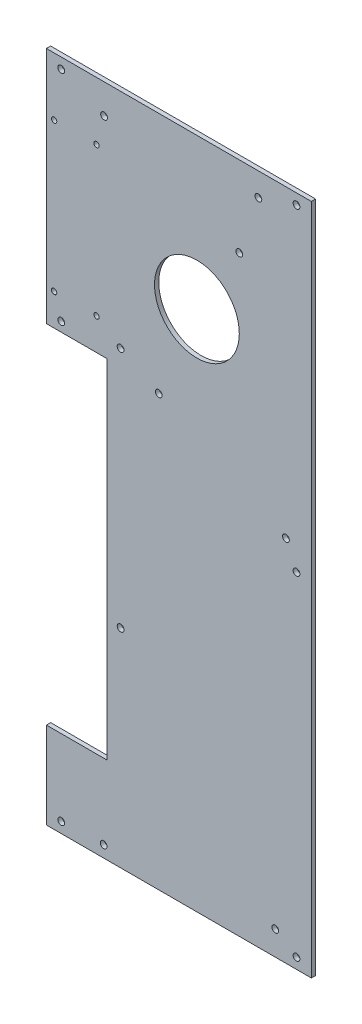
ISO-10303-21;
HEADER;
FILE_DESCRIPTION(('STEP AP214'),'2;1');
FILE_NAME('part.step','',(''),(''),'','','');
FILE_SCHEMA(('AUTOMOTIVE_DESIGN { 1 0 10303 214 1 1 1 1 }'));
ENDSEC;
DATA;
#1=APPLICATION_CONTEXT('core data for automotive mechanical design processes');
#2=APPLICATION_PROTOCOL_DEFINITION('international standard','automotive_design',2000,#1);
#3=PRODUCT_CONTEXT('',#1,'mechanical');
#4=PRODUCT('Part','Part','',(#3));
#5=PRODUCT_RELATED_PRODUCT_CATEGORY('part','',(#4));
#6=PRODUCT_DEFINITION_FORMATION('','',#4);
#7=PRODUCT_DEFINITION_CONTEXT('part definition',#1,'design');
#8=PRODUCT_DEFINITION('design','',#6,#7);
#9=PRODUCT_DEFINITION_SHAPE('','',#8);
#10=(LENGTH_UNIT() NAMED_UNIT(*) SI_UNIT(.MILLI.,.METRE.));
#11=(NAMED_UNIT(*) PLANE_ANGLE_UNIT() SI_UNIT($,.RADIAN.));
#12=(NAMED_UNIT(*) SI_UNIT($,.STERADIAN.) SOLID_ANGLE_UNIT());
#13=UNCERTAINTY_MEASURE_WITH_UNIT(LENGTH_MEASURE(1.E-05),#10,'distance_accuracy_value','');
#14=(GEOMETRIC_REPRESENTATION_CONTEXT(3) GLOBAL_UNCERTAINTY_ASSIGNED_CONTEXT((#13)) GLOBAL_UNIT_ASSIGNED_CONTEXT((#10,
#11,#12)) REPRESENTATION_CONTEXT('',''));
#15=CARTESIAN_POINT('',(0.,0.,0.));
#16=DIRECTION('',(0.,0.,1.));
#17=DIRECTION('',(1.,0.,0.));
#18=AXIS2_PLACEMENT_3D('',#15,#16,#17);
#19=CARTESIAN_POINT('',(-35.0000000000001,0.,-2.));
#20=DIRECTION('',(1.,0.,0.));
#21=DIRECTION('',(0.,1.,0.));
#22=AXIS2_PLACEMENT_3D('',#19,#20,#21);
#23=PLANE('',#22);
#24=DIRECTION('',(0.,1.,0.));
#25=VECTOR('',#24,1.);
#26=CARTESIAN_POINT('',(-35.0000000000001,0.,0.));
#27=LINE('',#26,#25);
#28=CARTESIAN_POINT('',(-35.,106.85,0.));
#29=VERTEX_POINT('',#28);
#30=CARTESIAN_POINT('',(-35.,219.3,0.));
#31=VERTEX_POINT('',#30);
#32=EDGE_CURVE('E201',#29,#31,#27,.T.);
#33=ORIENTED_EDGE('',*,*,#32,.T.);
#34=DIRECTION('',(0.,0.,1.));
#35=VECTOR('',#34,1.);
#36=CARTESIAN_POINT('',(-35.,219.3,-2.));
#37=LINE('',#36,#35);
#38=CARTESIAN_POINT('',(-35.,219.3,-2.));
#39=VERTEX_POINT('',#38);
#40=EDGE_CURVE('E11',#39,#31,#37,.T.);
#41=ORIENTED_EDGE('',*,*,#40,.F.);
#42=DIRECTION('',(0.,1.,0.));
#43=VECTOR('',#42,1.);
#44=CARTESIAN_POINT('',(-35.0000000000001,0.,-2.));
#45=LINE('',#44,#43);
#46=CARTESIAN_POINT('',(-35.,106.85,-2.));
#47=VERTEX_POINT('',#46);
#48=EDGE_CURVE('E278',#47,#39,#45,.T.);
#49=ORIENTED_EDGE('',*,*,#48,.F.);
#50=DIRECTION('',(0.,0.,1.));
#51=VECTOR('',#50,1.);
#52=CARTESIAN_POINT('',(-35.,106.85,-2.));
#53=LINE('',#52,#51);
#54=EDGE_CURVE('E46',#47,#29,#53,.T.);
#55=ORIENTED_EDGE('',*,*,#54,.T.);
#56=EDGE_LOOP('',(#33,#41,#49,#55));
#57=FACE_BOUND('',#56,.T.);
#58=ADVANCED_FACE('F43',(#57),#23,.F.);
#59=CARTESIAN_POINT('',(0.,219.3,-2.));
#60=DIRECTION('',(0.,-1.,0.));
#61=DIRECTION('',(0.,0.,-1.));
#62=AXIS2_PLACEMENT_3D('',#59,#60,#61);
#63=PLANE('',#62);
#64=DIRECTION('',(1.,0.,0.));
#65=VECTOR('',#64,1.);
#66=CARTESIAN_POINT('',(0.,219.3,0.));
#67=LINE('',#66,#65);
#68=CARTESIAN_POINT('',(90.,219.3,0.));
#69=VERTEX_POINT('',#68);
#70=EDGE_CURVE('E92',#31,#69,#67,.T.);
#71=ORIENTED_EDGE('',*,*,#70,.T.);
#72=DIRECTION('',(0.,0.,1.));
#73=VECTOR('',#72,1.);
#74=CARTESIAN_POINT('',(90.,219.3,-2.));
#75=LINE('',#74,#73);
#76=CARTESIAN_POINT('',(90.,219.3,-2.));
#77=VERTEX_POINT('',#76);
#78=EDGE_CURVE('E55',#77,#69,#75,.T.);
#79=ORIENTED_EDGE('',*,*,#78,.F.);
#80=DIRECTION('',(1.,0.,0.));
#81=VECTOR('',#80,1.);
#82=CARTESIAN_POINT('',(0.,219.3,-2.));
#83=LINE('',#82,#81);
#84=EDGE_CURVE('E58',#39,#77,#83,.T.);
#85=ORIENTED_EDGE('',*,*,#84,.F.);
#86=ORIENTED_EDGE('',*,*,#40,.T.);
#87=EDGE_LOOP('',(#71,#79,#85,#86));
#88=FACE_BOUND('',#87,.T.);
#89=ADVANCED_FACE('F307',(#88),#63,.F.);
#90=CARTESIAN_POINT('',(90.,0.,-2.));
#91=DIRECTION('',(1.,0.,0.));
#92=DIRECTION('',(0.,0.,-1.));
#93=AXIS2_PLACEMENT_3D('',#90,#91,#92);
#94=PLANE('',#93);
#95=DIRECTION('',(0.,1.,0.));
#96=VECTOR('',#95,1.);
#97=CARTESIAN_POINT('',(90.,0.,0.));
#98=LINE('',#97,#96);
#99=CARTESIAN_POINT('',(90.,-98.,0.));
#100=VERTEX_POINT('',#99);
#101=EDGE_CURVE('E117',#100,#69,#98,.T.);
#102=ORIENTED_EDGE('',*,*,#101,.F.);
#103=DIRECTION('',(0.,0.,1.));
#104=VECTOR('',#103,1.);
#105=CARTESIAN_POINT('',(90.,-98.,-2.));
#106=LINE('',#105,#104);
#107=CARTESIAN_POINT('',(90.,-98.,-2.));
#108=VERTEX_POINT('',#107);
#109=EDGE_CURVE('E112',#108,#100,#106,.T.);
#110=ORIENTED_EDGE('',*,*,#109,.F.);
#111=DIRECTION('',(0.,1.,0.));
#112=VECTOR('',#111,1.);
#113=CARTESIAN_POINT('',(90.,0.,-2.));
#114=LINE('',#113,#112);
#115=EDGE_CURVE('E120',#108,#77,#114,.T.);
#116=ORIENTED_EDGE('',*,*,#115,.T.);
#117=ORIENTED_EDGE('',*,*,#78,.T.);
#118=EDGE_LOOP('',(#102,#110,#116,#117));
#119=FACE_BOUND('',#118,.T.);
#120=ADVANCED_FACE('F116',(#119),#94,.T.);
#121=CARTESIAN_POINT('',(0.,-98.,-2.));
#122=DIRECTION('',(0.,-1.,0.));
#123=DIRECTION('',(1.,0.,0.));
#124=AXIS2_PLACEMENT_3D('',#121,#122,#123);
#125=PLANE('',#124);
#126=DIRECTION('',(1.,0.,0.));
#127=VECTOR('',#126,1.);
#128=CARTESIAN_POINT('',(0.,-98.,0.));
#129=LINE('',#128,#127);
#130=CARTESIAN_POINT('',(-35.,-98.,0.));
#131=VERTEX_POINT('',#130);
#132=EDGE_CURVE('E217',#131,#100,#129,.T.);
#133=ORIENTED_EDGE('',*,*,#132,.F.);
#134=DIRECTION('',(0.,0.,1.));
#135=VECTOR('',#134,1.);
#136=CARTESIAN_POINT('',(-35.,-98.,-2.));
#137=LINE('',#136,#135);
#138=CARTESIAN_POINT('',(-35.,-98.,-2.));
#139=VERTEX_POINT('',#138);
#140=EDGE_CURVE('E124',#139,#131,#137,.T.);
#141=ORIENTED_EDGE('',*,*,#140,.F.);
#142=DIRECTION('',(1.,0.,0.));
#143=VECTOR('',#142,1.);
#144=CARTESIAN_POINT('',(0.,-98.,-2.));
#145=LINE('',#144,#143);
#146=EDGE_CURVE('E127',#139,#108,#145,.T.);
#147=ORIENTED_EDGE('',*,*,#146,.T.);
#148=ORIENTED_EDGE('',*,*,#109,.T.);
#149=EDGE_LOOP('',(#133,#141,#147,#148));
#150=FACE_BOUND('',#149,.T.);
#151=ADVANCED_FACE('F133',(#150),#125,.T.);
#152=CARTESIAN_POINT('',(-35.0000000000001,0.,-2.));
#153=DIRECTION('',(-1.,0.,0.));
#154=DIRECTION('',(0.,-1.,0.));
#155=AXIS2_PLACEMENT_3D('',#152,#153,#154);
#156=PLANE('',#155);
#157=DIRECTION('',(0.,-1.,0.));
#158=VECTOR('',#157,1.);
#159=CARTESIAN_POINT('',(-35.0000000000001,0.,0.));
#160=LINE('',#159,#158);
#161=CARTESIAN_POINT('',(-35.,-57.15,0.));
#162=VERTEX_POINT('',#161);
#163=EDGE_CURVE('E215',#162,#131,#160,.T.);
#164=ORIENTED_EDGE('',*,*,#163,.F.);
#165=DIRECTION('',(0.,0.,1.));
#166=VECTOR('',#165,1.);
#167=CARTESIAN_POINT('',(-35.,-57.15,-2.));
#168=LINE('',#167,#166);
#169=CARTESIAN_POINT('',(-35.,-57.15,-2.));
#170=VERTEX_POINT('',#169);
#171=EDGE_CURVE('E283',#170,#162,#168,.T.);
#172=ORIENTED_EDGE('',*,*,#171,.F.);
#173=DIRECTION('',(0.,-1.,0.));
#174=VECTOR('',#173,1.);
#175=CARTESIAN_POINT('',(-35.0000000000001,0.,-2.));
#176=LINE('',#175,#174);
#177=EDGE_CURVE('E134',#170,#139,#176,.T.);
#178=ORIENTED_EDGE('',*,*,#177,.T.);
#179=ORIENTED_EDGE('',*,*,#140,.T.);
#180=EDGE_LOOP('',(#164,#172,#178,#179));
#181=FACE_BOUND('',#180,.T.);
#182=ADVANCED_FACE('F321',(#181),#156,.T.);
#183=CARTESIAN_POINT('',(0.,-57.15,-2.));
#184=DIRECTION('',(0.,1.,0.));
#185=DIRECTION('',(-1.,0.,0.));
#186=AXIS2_PLACEMENT_3D('',#183,#184,#185);
#187=PLANE('',#186);
#188=DIRECTION('',(-1.,0.,0.));
#189=VECTOR('',#188,1.);
#190=CARTESIAN_POINT('',(0.,-57.15,0.));
#191=LINE('',#190,#189);
#192=CARTESIAN_POINT('',(-6.35,-57.15,0.));
#193=VERTEX_POINT('',#192);
#194=EDGE_CURVE('E208',#193,#162,#191,.T.);
#195=ORIENTED_EDGE('',*,*,#194,.F.);
#196=DIRECTION('',(0.,0.,1.));
#197=VECTOR('',#196,1.);
#198=CARTESIAN_POINT('',(-6.35,-57.15,-2.));
#199=LINE('',#198,#197);
#200=CARTESIAN_POINT('',(-6.35,-57.15,-2.));
#201=VERTEX_POINT('',#200);
#202=EDGE_CURVE('E281',#201,#193,#199,.T.);
#203=ORIENTED_EDGE('',*,*,#202,.F.);
#204=DIRECTION('',(-1.,0.,0.));
#205=VECTOR('',#204,1.);
#206=CARTESIAN_POINT('',(0.,-57.15,-2.));
#207=LINE('',#206,#205);
#208=EDGE_CURVE('E136',#201,#170,#207,.T.);
#209=ORIENTED_EDGE('',*,*,#208,.T.);
#210=ORIENTED_EDGE('',*,*,#171,.T.);
#211=EDGE_LOOP('',(#195,#203,#209,#210));
#212=FACE_BOUND('',#211,.T.);
#213=ADVANCED_FACE('F322',(#212),#187,.T.);
#214=CARTESIAN_POINT('',(-6.35,0.,-2.));
#215=DIRECTION('',(1.,0.,0.));
#216=DIRECTION('',(0.,1.,0.));
#217=AXIS2_PLACEMENT_3D('',#214,#215,#216);
#218=PLANE('',#217);
#219=DIRECTION('',(0.,1.,0.));
#220=VECTOR('',#219,1.);
#221=CARTESIAN_POINT('',(-6.35,0.,0.));
#222=LINE('',#221,#220);
#223=CARTESIAN_POINT('',(-6.35,106.85,0.));
#224=VERTEX_POINT('',#223);
#225=EDGE_CURVE('E210',#193,#224,#222,.T.);
#226=ORIENTED_EDGE('',*,*,#225,.T.);
#227=DIRECTION('',(0.,0.,1.));
#228=VECTOR('',#227,1.);
#229=CARTESIAN_POINT('',(-6.35,106.85,-2.));
#230=LINE('',#229,#228);
#231=CARTESIAN_POINT('',(-6.35,106.85,-2.));
#232=VERTEX_POINT('',#231);
#233=EDGE_CURVE('E286',#232,#224,#230,.T.);
#234=ORIENTED_EDGE('',*,*,#233,.F.);
#235=DIRECTION('',(0.,1.,0.));
#236=VECTOR('',#235,1.);
#237=CARTESIAN_POINT('',(-6.35,0.,-2.));
#238=LINE('',#237,#236);
#239=EDGE_CURVE('E343',#201,#232,#238,.T.);
#240=ORIENTED_EDGE('',*,*,#239,.F.);
#241=ORIENTED_EDGE('',*,*,#202,.T.);
#242=EDGE_LOOP('',(#226,#234,#240,#241));
#243=FACE_BOUND('',#242,.T.);
#244=ADVANCED_FACE('F328',(#243),#218,.F.);
#245=CARTESIAN_POINT('',(-28.,-93.,-2.));
#246=DIRECTION('',(0.,0.,1.));
#247=DIRECTION('',(1.,0.,0.));
#248=AXIS2_PLACEMENT_3D('',#245,#246,#247);
#249=CYLINDRICAL_SURFACE('',#248,1.6);
#250=CARTESIAN_POINT('',(-28.,-93.,-2.));
#251=DIRECTION('',(0.,0.,1.));
#252=DIRECTION('',(1.,0.,0.));
#253=AXIS2_PLACEMENT_3D('',#250,#251,#252);
#254=CIRCLE('',#253,1.6);
#255=CARTESIAN_POINT('',(-26.4,-93.,-2.));
#256=VERTEX_POINT('',#255);
#257=EDGE_CURVE('E192',#256,#256,#254,.T.);
#258=ORIENTED_EDGE('',*,*,#257,.F.);
#259=EDGE_LOOP('',(#258));
#260=FACE_BOUND('',#259,.T.);
#261=CARTESIAN_POINT('',(-28.,-93.,0.));
#262=DIRECTION('',(0.,0.,1.));
#263=DIRECTION('',(1.,0.,0.));
#264=AXIS2_PLACEMENT_3D('',#261,#262,#263);
#265=CIRCLE('',#264,1.6);
#266=CARTESIAN_POINT('',(-26.4,-93.,0.));
#267=VERTEX_POINT('',#266);
#268=EDGE_CURVE('E274',#267,#267,#265,.T.);
#269=ORIENTED_EDGE('',*,*,#268,.T.);
#270=EDGE_LOOP('',(#269));
#271=FACE_BOUND('',#270,.T.);
#272=ADVANCED_FACE('F331',(#260,#271),#249,.F.);
#273=CARTESIAN_POINT('',(-31.35,121.85,-2.));
#274=DIRECTION('',(0.,0.,1.));
#275=DIRECTION('',(1.,0.,0.));
#276=AXIS2_PLACEMENT_3D('',#273,#274,#275);
#277=CYLINDRICAL_SURFACE('',#276,1.25);
#278=CARTESIAN_POINT('',(-31.35,121.85,-2.));
#279=DIRECTION('',(0.,0.,1.));
#280=DIRECTION('',(1.,0.,0.));
#281=AXIS2_PLACEMENT_3D('',#278,#279,#280);
#282=CIRCLE('',#281,1.25);
#283=CARTESIAN_POINT('',(-30.1,121.85,-2.));
#284=VERTEX_POINT('',#283);
#285=EDGE_CURVE('E191',#284,#284,#282,.T.);
#286=ORIENTED_EDGE('',*,*,#285,.F.);
#287=EDGE_LOOP('',(#286));
#288=FACE_BOUND('',#287,.T.);
#289=CARTESIAN_POINT('',(-31.35,121.85,0.));
#290=DIRECTION('',(0.,0.,1.));
#291=DIRECTION('',(1.,0.,0.));
#292=AXIS2_PLACEMENT_3D('',#289,#290,#291);
#293=CIRCLE('',#292,1.25);
#294=CARTESIAN_POINT('',(-30.1,121.85,0.));
#295=VERTEX_POINT('',#294);
#296=EDGE_CURVE('E272',#295,#295,#293,.T.);
#297=ORIENTED_EDGE('',*,*,#296,.T.);
#298=EDGE_LOOP('',(#297));
#299=FACE_BOUND('',#298,.T.);
#300=ADVANCED_FACE('F337',(#288,#299),#277,.F.);
#301=CARTESIAN_POINT('',(-11.35,121.85,-2.));
#302=DIRECTION('',(0.,0.,1.));
#303=DIRECTION('',(1.,0.,0.));
#304=AXIS2_PLACEMENT_3D('',#301,#302,#303);
#305=CYLINDRICAL_SURFACE('',#304,1.25);
#306=CARTESIAN_POINT('',(-11.35,121.85,-2.));
#307=DIRECTION('',(0.,0.,1.));
#308=DIRECTION('',(1.,0.,0.));
#309=AXIS2_PLACEMENT_3D('',#306,#307,#308);
#310=CIRCLE('',#309,1.25);
#311=CARTESIAN_POINT('',(-10.1,121.85,-2.));
#312=VERTEX_POINT('',#311);
#313=EDGE_CURVE('E186',#312,#312,#310,.T.);
#314=ORIENTED_EDGE('',*,*,#313,.F.);
#315=EDGE_LOOP('',(#314));
#316=FACE_BOUND('',#315,.T.);
#317=CARTESIAN_POINT('',(-11.35,121.85,0.));
#318=DIRECTION('',(0.,0.,1.));
#319=DIRECTION('',(1.,0.,0.));
#320=AXIS2_PLACEMENT_3D('',#317,#318,#319);
#321=CIRCLE('',#320,1.25);
#322=CARTESIAN_POINT('',(-10.1,121.85,0.));
#323=VERTEX_POINT('',#322);
#324=EDGE_CURVE('E268',#323,#323,#321,.T.);
#325=ORIENTED_EDGE('',*,*,#324,.T.);
#326=EDGE_LOOP('',(#325));
#327=FACE_BOUND('',#326,.T.);
#328=ADVANCED_FACE('F355',(#316,#327),#305,.F.);
#329=CARTESIAN_POINT('',(-11.35,191.85,-2.));
#330=DIRECTION('',(0.,0.,1.));
#331=DIRECTION('',(1.,0.,0.));
#332=AXIS2_PLACEMENT_3D('',#329,#330,#331);
#333=CYLINDRICAL_SURFACE('',#332,1.25000000000001);
#334=CARTESIAN_POINT('',(-11.35,191.85,-2.));
#335=DIRECTION('',(0.,0.,1.));
#336=DIRECTION('',(1.,0.,0.));
#337=AXIS2_PLACEMENT_3D('',#334,#335,#336);
#338=CIRCLE('',#337,1.25000000000001);
#339=CARTESIAN_POINT('',(-10.1,191.85,-2.));
#340=VERTEX_POINT('',#339);
#341=EDGE_CURVE('E187',#340,#340,#338,.T.);
#342=ORIENTED_EDGE('',*,*,#341,.F.);
#343=EDGE_LOOP('',(#342));
#344=FACE_BOUND('',#343,.T.);
#345=CARTESIAN_POINT('',(-11.35,191.85,0.));
#346=DIRECTION('',(0.,0.,1.));
#347=DIRECTION('',(1.,0.,0.));
#348=AXIS2_PLACEMENT_3D('',#345,#346,#347);
#349=CIRCLE('',#348,1.25000000000001);
#350=CARTESIAN_POINT('',(-10.1,191.85,0.));
#351=VERTEX_POINT('',#350);
#352=EDGE_CURVE('E261',#351,#351,#349,.T.);
#353=ORIENTED_EDGE('',*,*,#352,.T.);
#354=EDGE_LOOP('',(#353));
#355=FACE_BOUND('',#354,.T.);
#356=ADVANCED_FACE('F363',(#344,#355),#333,.F.);
#357=CARTESIAN_POINT('',(-31.35,191.85,-2.));
#358=DIRECTION('',(0.,0.,1.));
#359=DIRECTION('',(1.,0.,0.));
#360=AXIS2_PLACEMENT_3D('',#357,#358,#359);
#361=CYLINDRICAL_SURFACE('',#360,1.24999999999998);
#362=CARTESIAN_POINT('',(-31.35,191.85,-2.));
#363=DIRECTION('',(0.,0.,1.));
#364=DIRECTION('',(1.,0.,0.));
#365=AXIS2_PLACEMENT_3D('',#362,#363,#364);
#366=CIRCLE('',#365,1.24999999999998);
#367=CARTESIAN_POINT('',(-30.1,191.85,-2.));
#368=VERTEX_POINT('',#367);
#369=EDGE_CURVE('E182',#368,#368,#366,.T.);
#370=ORIENTED_EDGE('',*,*,#369,.F.);
#371=EDGE_LOOP('',(#370));
#372=FACE_BOUND('',#371,.T.);
#373=CARTESIAN_POINT('',(-31.35,191.85,0.));
#374=DIRECTION('',(0.,0.,1.));
#375=DIRECTION('',(1.,0.,0.));
#376=AXIS2_PLACEMENT_3D('',#373,#374,#375);
#377=CIRCLE('',#376,1.24999999999998);
#378=CARTESIAN_POINT('',(-30.1,191.85,0.));
#379=VERTEX_POINT('',#378);
#380=EDGE_CURVE('E265',#379,#379,#377,.T.);
#381=ORIENTED_EDGE('',*,*,#380,.T.);
#382=EDGE_LOOP('',(#381));
#383=FACE_BOUND('',#382,.T.);
#384=ADVANCED_FACE('F362',(#372,#383),#361,.F.);
#385=CARTESIAN_POINT('',(-28.,111.3,-2.));
#386=DIRECTION('',(0.,0.,1.));
#387=DIRECTION('',(1.,0.,0.));
#388=AXIS2_PLACEMENT_3D('',#385,#386,#387);
#389=CYLINDRICAL_SURFACE('',#388,1.6);
#390=CARTESIAN_POINT('',(-28.,111.3,-2.));
#391=DIRECTION('',(0.,0.,1.));
#392=DIRECTION('',(1.,0.,0.));
#393=AXIS2_PLACEMENT_3D('',#390,#391,#392);
#394=CIRCLE('',#393,1.6);
#395=CARTESIAN_POINT('',(-26.4,111.3,-2.));
#396=VERTEX_POINT('',#395);
#397=EDGE_CURVE('E179',#396,#396,#394,.T.);
#398=ORIENTED_EDGE('',*,*,#397,.F.);
#399=EDGE_LOOP('',(#398));
#400=FACE_BOUND('',#399,.T.);
#401=CARTESIAN_POINT('',(-28.,111.3,0.));
#402=DIRECTION('',(0.,0.,1.));
#403=DIRECTION('',(1.,0.,0.));
#404=AXIS2_PLACEMENT_3D('',#401,#402,#403);
#405=CIRCLE('',#404,1.6);
#406=CARTESIAN_POINT('',(-26.4,111.3,0.));
#407=VERTEX_POINT('',#406);
#408=EDGE_CURVE('E258',#407,#407,#405,.T.);
#409=ORIENTED_EDGE('',*,*,#408,.T.);
#410=EDGE_LOOP('',(#409));
#411=FACE_BOUND('',#410,.T.);
#412=ADVANCED_FACE('F367',(#400,#411),#389,.F.);
#413=CARTESIAN_POINT('',(-28.,214.3,-2.));
#414=DIRECTION('',(0.,0.,1.));
#415=DIRECTION('',(1.,0.,0.));
#416=AXIS2_PLACEMENT_3D('',#413,#414,#415);
#417=CYLINDRICAL_SURFACE('',#416,1.59999999999999);
#418=CARTESIAN_POINT('',(-28.,214.3,-2.));
#419=DIRECTION('',(0.,0.,1.));
#420=DIRECTION('',(1.,0.,0.));
#421=AXIS2_PLACEMENT_3D('',#418,#419,#420);
#422=CIRCLE('',#421,1.59999999999999);
#423=CARTESIAN_POINT('',(-26.4,214.3,-2.));
#424=VERTEX_POINT('',#423);
#425=EDGE_CURVE('E180',#424,#424,#422,.T.);
#426=ORIENTED_EDGE('',*,*,#425,.F.);
#427=EDGE_LOOP('',(#426));
#428=FACE_BOUND('',#427,.T.);
#429=CARTESIAN_POINT('',(-28.,214.3,0.));
#430=DIRECTION('',(0.,0.,1.));
#431=DIRECTION('',(1.,0.,0.));
#432=AXIS2_PLACEMENT_3D('',#429,#430,#431);
#433=CIRCLE('',#432,1.59999999999999);
#434=CARTESIAN_POINT('',(-26.4,214.3,0.));
#435=VERTEX_POINT('',#434);
#436=EDGE_CURVE('E259',#435,#435,#433,.T.);
#437=ORIENTED_EDGE('',*,*,#436,.T.);
#438=EDGE_LOOP('',(#437));
#439=FACE_BOUND('',#438,.T.);
#440=ADVANCED_FACE('F373',(#428,#439),#417,.F.);
#441=CARTESIAN_POINT('',(73.,-86.5,-2.));
#442=DIRECTION('',(0.,0.,1.));
#443=DIRECTION('',(1.,0.,0.));
#444=AXIS2_PLACEMENT_3D('',#441,#442,#443);
#445=CYLINDRICAL_SURFACE('',#444,1.60000000000001);
#446=CARTESIAN_POINT('',(73.,-86.5,-2.));
#447=DIRECTION('',(0.,0.,1.));
#448=DIRECTION('',(1.,0.,0.));
#449=AXIS2_PLACEMENT_3D('',#446,#447,#448);
#450=CIRCLE('',#449,1.60000000000001);
#451=CARTESIAN_POINT('',(74.6,-86.5,-2.));
#452=VERTEX_POINT('',#451);
#453=EDGE_CURVE('E172',#452,#452,#450,.T.);
#454=ORIENTED_EDGE('',*,*,#453,.F.);
#455=EDGE_LOOP('',(#454));
#456=FACE_BOUND('',#455,.T.);
#457=CARTESIAN_POINT('',(73.,-86.5,0.));
#458=DIRECTION('',(0.,0.,1.));
#459=DIRECTION('',(1.,0.,0.));
#460=AXIS2_PLACEMENT_3D('',#457,#458,#459);
#461=CIRCLE('',#460,1.60000000000001);
#462=CARTESIAN_POINT('',(74.6,-86.5,0.));
#463=VERTEX_POINT('',#462);
#464=EDGE_CURVE('E254',#463,#463,#461,.T.);
#465=ORIENTED_EDGE('',*,*,#464,.T.);
#466=EDGE_LOOP('',(#465));
#467=FACE_BOUND('',#466,.T.);
#468=ADVANCED_FACE('F380',(#456,#467),#445,.F.);
#469=CARTESIAN_POINT('',(0.,0.,-2.));
#470=DIRECTION('',(0.,0.,1.));
#471=DIRECTION('',(1.,0.,0.));
#472=AXIS2_PLACEMENT_3D('',#469,#470,#471);
#473=CYLINDRICAL_SURFACE('',#472,1.6);
#474=CARTESIAN_POINT('',(0.,0.,-2.));
#475=DIRECTION('',(0.,0.,1.));
#476=DIRECTION('',(1.,0.,0.));
#477=AXIS2_PLACEMENT_3D('',#474,#475,#476);
#478=CIRCLE('',#477,1.6);
#479=CARTESIAN_POINT('',(1.6,0.,-2.));
#480=VERTEX_POINT('',#479);
#481=EDGE_CURVE('E171',#480,#480,#478,.T.);
#482=ORIENTED_EDGE('',*,*,#481,.F.);
#483=EDGE_LOOP('',(#482));
#484=FACE_BOUND('',#483,.T.);
#485=CARTESIAN_POINT('',(0.,0.,0.));
#486=DIRECTION('',(0.,0.,1.));
#487=DIRECTION('',(1.,0.,0.));
#488=AXIS2_PLACEMENT_3D('',#485,#486,#487);
#489=CIRCLE('',#488,1.6);
#490=CARTESIAN_POINT('',(1.6,0.,0.));
#491=VERTEX_POINT('',#490);
#492=EDGE_CURVE('E249',#491,#491,#489,.T.);
#493=ORIENTED_EDGE('',*,*,#492,.T.);
#494=EDGE_LOOP('',(#493));
#495=FACE_BOUND('',#494,.T.);
#496=ADVANCED_FACE('F382',(#484,#495),#473,.F.);
#497=CARTESIAN_POINT('',(0.,114.3,-2.));
#498=DIRECTION('',(0.,0.,1.));
#499=DIRECTION('',(1.,0.,0.));
#500=AXIS2_PLACEMENT_3D('',#497,#498,#499);
#501=CYLINDRICAL_SURFACE('',#500,1.60000000000001);
#502=CARTESIAN_POINT('',(0.,114.3,-2.));
#503=DIRECTION('',(0.,0.,1.));
#504=DIRECTION('',(1.,0.,0.));
#505=AXIS2_PLACEMENT_3D('',#502,#503,#504);
#506=CIRCLE('',#505,1.60000000000001);
#507=CARTESIAN_POINT('',(1.60000000000001,114.3,-2.));
#508=VERTEX_POINT('',#507);
#509=EDGE_CURVE('E166',#508,#508,#506,.T.);
#510=ORIENTED_EDGE('',*,*,#509,.F.);
#511=EDGE_LOOP('',(#510));
#512=FACE_BOUND('',#511,.T.);
#513=CARTESIAN_POINT('',(0.,114.3,0.));
#514=DIRECTION('',(0.,0.,1.));
#515=DIRECTION('',(1.,0.,0.));
#516=AXIS2_PLACEMENT_3D('',#513,#514,#515);
#517=CIRCLE('',#516,1.60000000000001);
#518=CARTESIAN_POINT('',(1.60000000000001,114.3,0.));
#519=VERTEX_POINT('',#518);
#520=EDGE_CURVE('E250',#519,#519,#517,.T.);
#521=ORIENTED_EDGE('',*,*,#520,.T.);
#522=EDGE_LOOP('',(#521));
#523=FACE_BOUND('',#522,.T.);
#524=ADVANCED_FACE('F383',(#512,#523),#501,.F.);
#525=CARTESIAN_POINT('',(18.,104.8,-2.));
#526=DIRECTION('',(0.,0.,1.));
#527=DIRECTION('',(1.,0.,0.));
#528=AXIS2_PLACEMENT_3D('',#525,#526,#527);
#529=CYLINDRICAL_SURFACE('',#528,1.6);
#530=CARTESIAN_POINT('',(18.,104.8,-2.));
#531=DIRECTION('',(0.,0.,1.));
#532=DIRECTION('',(1.,0.,0.));
#533=AXIS2_PLACEMENT_3D('',#530,#531,#532);
#534=CIRCLE('',#533,1.6);
#535=CARTESIAN_POINT('',(19.6,104.8,-2.));
#536=VERTEX_POINT('',#535);
#537=EDGE_CURVE('E164',#536,#536,#534,.T.);
#538=ORIENTED_EDGE('',*,*,#537,.F.);
#539=EDGE_LOOP('',(#538));
#540=FACE_BOUND('',#539,.T.);
#541=CARTESIAN_POINT('',(18.,104.8,0.));
#542=DIRECTION('',(0.,0.,1.));
#543=DIRECTION('',(1.,0.,0.));
#544=AXIS2_PLACEMENT_3D('',#541,#542,#543);
#545=CIRCLE('',#544,1.6);
#546=CARTESIAN_POINT('',(19.6,104.8,0.));
#547=VERTEX_POINT('',#546);
#548=EDGE_CURVE('E242',#547,#547,#545,.T.);
#549=ORIENTED_EDGE('',*,*,#548,.T.);
#550=EDGE_LOOP('',(#549));
#551=FACE_BOUND('',#550,.T.);
#552=ADVANCED_FACE('F388',(#540,#551),#529,.F.);
#553=CARTESIAN_POINT('',(56.,181.3,-2.));
#554=DIRECTION('',(0.,0.,1.));
#555=DIRECTION('',(1.,0.,0.));
#556=AXIS2_PLACEMENT_3D('',#553,#554,#555);
#557=CYLINDRICAL_SURFACE('',#556,1.59999999999999);
#558=CARTESIAN_POINT('',(56.,181.3,-2.));
#559=DIRECTION('',(0.,0.,1.));
#560=DIRECTION('',(1.,0.,0.));
#561=AXIS2_PLACEMENT_3D('',#558,#559,#560);
#562=CIRCLE('',#561,1.59999999999999);
#563=CARTESIAN_POINT('',(57.6,181.3,-2.));
#564=VERTEX_POINT('',#563);
#565=EDGE_CURVE('E162',#564,#564,#562,.T.);
#566=ORIENTED_EDGE('',*,*,#565,.F.);
#567=EDGE_LOOP('',(#566));
#568=FACE_BOUND('',#567,.T.);
#569=CARTESIAN_POINT('',(56.,181.3,0.));
#570=DIRECTION('',(0.,0.,1.));
#571=DIRECTION('',(1.,0.,0.));
#572=AXIS2_PLACEMENT_3D('',#569,#570,#571);
#573=CIRCLE('',#572,1.59999999999999);
#574=CARTESIAN_POINT('',(57.6,181.3,0.));
#575=VERTEX_POINT('',#574);
#576=EDGE_CURVE('E241',#575,#575,#573,.T.);
#577=ORIENTED_EDGE('',*,*,#576,.T.);
#578=EDGE_LOOP('',(#577));
#579=FACE_BOUND('',#578,.T.);
#580=ADVANCED_FACE('F393',(#568,#579),#557,.F.);
#581=CARTESIAN_POINT('',(65.,208.3,-2.));
#582=DIRECTION('',(0.,0.,1.));
#583=DIRECTION('',(1.,0.,0.));
#584=AXIS2_PLACEMENT_3D('',#581,#582,#583);
#585=CYLINDRICAL_SURFACE('',#584,1.59999999999999);
#586=CARTESIAN_POINT('',(65.,208.3,-2.));
#587=DIRECTION('',(0.,0.,1.));
#588=DIRECTION('',(1.,0.,0.));
#589=AXIS2_PLACEMENT_3D('',#586,#587,#588);
#590=CIRCLE('',#589,1.59999999999999);
#591=CARTESIAN_POINT('',(66.6,208.3,-2.));
#592=VERTEX_POINT('',#591);
#593=EDGE_CURVE('E157',#592,#592,#590,.T.);
#594=ORIENTED_EDGE('',*,*,#593,.F.);
#595=EDGE_LOOP('',(#594));
#596=FACE_BOUND('',#595,.T.);
#597=CARTESIAN_POINT('',(65.,208.3,0.));
#598=DIRECTION('',(0.,0.,1.));
#599=DIRECTION('',(1.,0.,0.));
#600=AXIS2_PLACEMENT_3D('',#597,#598,#599);
#601=CIRCLE('',#600,1.59999999999999);
#602=CARTESIAN_POINT('',(66.6,208.3,0.));
#603=VERTEX_POINT('',#602);
#604=EDGE_CURVE('E238',#603,#603,#601,.T.);
#605=ORIENTED_EDGE('',*,*,#604,.T.);
#606=EDGE_LOOP('',(#605));
#607=FACE_BOUND('',#606,.T.);
#608=ADVANCED_FACE('F400',(#596,#607),#585,.F.);
#609=CARTESIAN_POINT('',(78.,75.7,-2.));
#610=DIRECTION('',(0.,0.,1.));
#611=DIRECTION('',(1.,0.,0.));
#612=AXIS2_PLACEMENT_3D('',#609,#610,#611);
#613=CYLINDRICAL_SURFACE('',#612,1.60000000000001);
#614=CARTESIAN_POINT('',(78.,75.7,-2.));
#615=DIRECTION('',(0.,0.,1.));
#616=DIRECTION('',(1.,0.,0.));
#617=AXIS2_PLACEMENT_3D('',#614,#615,#616);
#618=CIRCLE('',#617,1.60000000000001);
#619=CARTESIAN_POINT('',(79.6,75.7,-2.));
#620=VERTEX_POINT('',#619);
#621=EDGE_CURVE('E156',#620,#620,#618,.T.);
#622=ORIENTED_EDGE('',*,*,#621,.F.);
#623=EDGE_LOOP('',(#622));
#624=FACE_BOUND('',#623,.T.);
#625=CARTESIAN_POINT('',(78.,75.7,0.));
#626=DIRECTION('',(0.,0.,1.));
#627=DIRECTION('',(1.,0.,0.));
#628=AXIS2_PLACEMENT_3D('',#625,#626,#627);
#629=CIRCLE('',#628,1.60000000000001);
#630=CARTESIAN_POINT('',(79.6,75.7,0.));
#631=VERTEX_POINT('',#630);
#632=EDGE_CURVE('E232',#631,#631,#629,.T.);
#633=ORIENTED_EDGE('',*,*,#632,.T.);
#634=EDGE_LOOP('',(#633));
#635=FACE_BOUND('',#634,.T.);
#636=ADVANCED_FACE('F402',(#624,#635),#613,.F.);
#637=CARTESIAN_POINT('',(36.,148.3,-2.));
#638=DIRECTION('',(0.,0.,1.));
#639=DIRECTION('',(1.,0.,0.));
#640=AXIS2_PLACEMENT_3D('',#637,#638,#639);
#641=CYLINDRICAL_SURFACE('',#640,20.);
#642=CARTESIAN_POINT('',(36.,148.3,-2.));
#643=DIRECTION('',(0.,0.,1.));
#644=DIRECTION('',(1.,0.,0.));
#645=AXIS2_PLACEMENT_3D('',#642,#643,#644);
#646=CIRCLE('',#645,20.);
#647=CARTESIAN_POINT('',(56.,148.3,-2.));
#648=VERTEX_POINT('',#647);
#649=EDGE_CURVE('E153',#648,#648,#646,.T.);
#650=ORIENTED_EDGE('',*,*,#649,.F.);
#651=EDGE_LOOP('',(#650));
#652=FACE_BOUND('',#651,.T.);
#653=CARTESIAN_POINT('',(36.,148.3,0.));
#654=DIRECTION('',(0.,0.,1.));
#655=DIRECTION('',(1.,0.,0.));
#656=AXIS2_PLACEMENT_3D('',#653,#654,#655);
#657=CIRCLE('',#656,20.);
#658=CARTESIAN_POINT('',(56.,148.3,0.));
#659=VERTEX_POINT('',#658);
#660=EDGE_CURVE('E235',#659,#659,#657,.T.);
#661=ORIENTED_EDGE('',*,*,#660,.T.);
#662=EDGE_LOOP('',(#661));
#663=FACE_BOUND('',#662,.T.);
#664=ADVANCED_FACE('F403',(#652,#663),#641,.F.);
#665=CARTESIAN_POINT('',(83.,-93.,-2.));
#666=DIRECTION('',(0.,0.,1.));
#667=DIRECTION('',(1.,0.,0.));
#668=AXIS2_PLACEMENT_3D('',#665,#666,#667);
#669=CYLINDRICAL_SURFACE('',#668,1.60000000000001);
#670=CARTESIAN_POINT('',(83.,-93.,-2.));
#671=DIRECTION('',(0.,0.,1.));
#672=DIRECTION('',(1.,0.,0.));
#673=AXIS2_PLACEMENT_3D('',#670,#671,#672);
#674=CIRCLE('',#673,1.60000000000001);
#675=CARTESIAN_POINT('',(84.6,-93.,-2.));
#676=VERTEX_POINT('',#675);
#677=EDGE_CURVE('E147',#676,#676,#674,.T.);
#678=ORIENTED_EDGE('',*,*,#677,.F.);
#679=EDGE_LOOP('',(#678));
#680=FACE_BOUND('',#679,.T.);
#681=CARTESIAN_POINT('',(83.,-93.,0.));
#682=DIRECTION('',(0.,0.,1.));
#683=DIRECTION('',(1.,0.,0.));
#684=AXIS2_PLACEMENT_3D('',#681,#682,#683);
#685=CIRCLE('',#684,1.60000000000001);
#686=CARTESIAN_POINT('',(84.6,-93.,0.));
#687=VERTEX_POINT('',#686);
#688=EDGE_CURVE('E230',#687,#687,#685,.T.);
#689=ORIENTED_EDGE('',*,*,#688,.T.);
#690=EDGE_LOOP('',(#689));
#691=FACE_BOUND('',#690,.T.);
#692=ADVANCED_FACE('F408',(#680,#691),#669,.F.);
#693=CARTESIAN_POINT('',(83.,214.3,-2.));
#694=DIRECTION('',(0.,0.,1.));
#695=DIRECTION('',(1.,0.,0.));
#696=AXIS2_PLACEMENT_3D('',#693,#694,#695);
#697=CYLINDRICAL_SURFACE('',#696,1.59999999999999);
#698=CARTESIAN_POINT('',(83.,214.3,-2.));
#699=DIRECTION('',(0.,0.,1.));
#700=DIRECTION('',(1.,0.,0.));
#701=AXIS2_PLACEMENT_3D('',#698,#699,#700);
#702=CIRCLE('',#701,1.59999999999999);
#703=CARTESIAN_POINT('',(84.6,214.3,-2.));
#704=VERTEX_POINT('',#703);
#705=EDGE_CURVE('E146',#704,#704,#702,.T.);
#706=ORIENTED_EDGE('',*,*,#705,.F.);
#707=EDGE_LOOP('',(#706));
#708=FACE_BOUND('',#707,.T.);
#709=CARTESIAN_POINT('',(83.,214.3,0.));
#710=DIRECTION('',(0.,0.,1.));
#711=DIRECTION('',(1.,0.,0.));
#712=AXIS2_PLACEMENT_3D('',#709,#710,#711);
#713=CIRCLE('',#712,1.59999999999999);
#714=CARTESIAN_POINT('',(84.6,214.3,0.));
#715=VERTEX_POINT('',#714);
#716=EDGE_CURVE('E228',#715,#715,#713,.T.);
#717=ORIENTED_EDGE('',*,*,#716,.T.);
#718=EDGE_LOOP('',(#717));
#719=FACE_BOUND('',#718,.T.);
#720=ADVANCED_FACE('F413',(#708,#719),#697,.F.);
#721=CARTESIAN_POINT('',(83.,64.3,-2.));
#722=DIRECTION('',(0.,0.,1.));
#723=DIRECTION('',(1.,0.,0.));
#724=AXIS2_PLACEMENT_3D('',#721,#722,#723);
#725=CYLINDRICAL_SURFACE('',#724,1.60000000000001);
#726=CARTESIAN_POINT('',(83.,64.3,-2.));
#727=DIRECTION('',(0.,0.,1.));
#728=DIRECTION('',(1.,0.,0.));
#729=AXIS2_PLACEMENT_3D('',#726,#727,#728);
#730=CIRCLE('',#729,1.60000000000001);
#731=CARTESIAN_POINT('',(84.6,64.3,-2.));
#732=VERTEX_POINT('',#731);
#733=EDGE_CURVE('E144',#732,#732,#730,.T.);
#734=ORIENTED_EDGE('',*,*,#733,.F.);
#735=EDGE_LOOP('',(#734));
#736=FACE_BOUND('',#735,.T.);
#737=CARTESIAN_POINT('',(83.,64.3,0.));
#738=DIRECTION('',(0.,0.,1.));
#739=DIRECTION('',(1.,0.,0.));
#740=AXIS2_PLACEMENT_3D('',#737,#738,#739);
#741=CIRCLE('',#740,1.60000000000001);
#742=CARTESIAN_POINT('',(84.6,64.3,0.));
#743=VERTEX_POINT('',#742);
#744=EDGE_CURVE('E223',#743,#743,#741,.T.);
#745=ORIENTED_EDGE('',*,*,#744,.T.);
#746=EDGE_LOOP('',(#745));
#747=FACE_BOUND('',#746,.T.);
#748=ADVANCED_FACE('F302',(#736,#747),#725,.F.);
#749=CARTESIAN_POINT('',(-7.8,205.3,-2.));
#750=DIRECTION('',(0.,0.,1.));
#751=DIRECTION('',(1.,0.,0.));
#752=AXIS2_PLACEMENT_3D('',#749,#750,#751);
#753=CYLINDRICAL_SURFACE('',#752,1.59999999999999);
#754=CARTESIAN_POINT('',(-7.8,205.3,-2.));
#755=DIRECTION('',(0.,0.,1.));
#756=DIRECTION('',(1.,0.,0.));
#757=AXIS2_PLACEMENT_3D('',#754,#755,#756);
#758=CIRCLE('',#757,1.59999999999999);
#759=CARTESIAN_POINT('',(-6.20000000000001,205.3,-2.));
#760=VERTEX_POINT('',#759);
#761=EDGE_CURVE('E142',#760,#760,#758,.T.);
#762=ORIENTED_EDGE('',*,*,#761,.F.);
#763=EDGE_LOOP('',(#762));
#764=FACE_BOUND('',#763,.T.);
#765=CARTESIAN_POINT('',(-7.8,205.3,0.));
#766=DIRECTION('',(0.,0.,1.));
#767=DIRECTION('',(1.,0.,0.));
#768=AXIS2_PLACEMENT_3D('',#765,#766,#767);
#769=CIRCLE('',#768,1.59999999999999);
#770=CARTESIAN_POINT('',(-6.20000000000001,205.3,0.));
#771=VERTEX_POINT('',#770);
#772=EDGE_CURVE('E216',#771,#771,#769,.T.);
#773=ORIENTED_EDGE('',*,*,#772,.T.);
#774=EDGE_LOOP('',(#773));
#775=FACE_BOUND('',#774,.T.);
#776=ADVANCED_FACE('F300',(#764,#775),#753,.F.);
#777=CARTESIAN_POINT('',(0.,106.85,-2.));
#778=DIRECTION('',(0.,-1.,0.));
#779=DIRECTION('',(0.,0.,-1.));
#780=AXIS2_PLACEMENT_3D('',#777,#778,#779);
#781=PLANE('',#780);
#782=DIRECTION('',(1.,0.,0.));
#783=VECTOR('',#782,1.);
#784=CARTESIAN_POINT('',(0.,106.85,0.));
#785=LINE('',#784,#783);
#786=EDGE_CURVE('E202',#29,#224,#785,.T.);
#787=ORIENTED_EDGE('',*,*,#786,.F.);
#788=ORIENTED_EDGE('',*,*,#54,.F.);
#789=DIRECTION('',(1.,0.,0.));
#790=VECTOR('',#789,1.);
#791=CARTESIAN_POINT('',(0.,106.85,-2.));
#792=LINE('',#791,#790);
#793=EDGE_CURVE('E342',#47,#232,#792,.T.);
#794=ORIENTED_EDGE('',*,*,#793,.T.);
#795=ORIENTED_EDGE('',*,*,#233,.T.);
#796=EDGE_LOOP('',(#787,#788,#794,#795));
#797=FACE_BOUND('',#796,.T.);
#798=ADVANCED_FACE('F295',(#797),#781,.T.);
#799=CARTESIAN_POINT('',(-8.,-92.5,-2.));
#800=DIRECTION('',(0.,0.,1.));
#801=DIRECTION('',(1.,0.,0.));
#802=AXIS2_PLACEMENT_3D('',#799,#800,#801);
#803=CYLINDRICAL_SURFACE('',#802,1.6);
#804=CARTESIAN_POINT('',(-8.,-92.5,-2.));
#805=DIRECTION('',(0.,0.,1.));
#806=DIRECTION('',(1.,0.,0.));
#807=AXIS2_PLACEMENT_3D('',#804,#805,#806);
#808=CIRCLE('',#807,1.6);
#809=CARTESIAN_POINT('',(-6.4,-92.5,-2.));
#810=VERTEX_POINT('',#809);
#811=EDGE_CURVE('E198',#810,#810,#808,.T.);
#812=ORIENTED_EDGE('',*,*,#811,.F.);
#813=EDGE_LOOP('',(#812));
#814=FACE_BOUND('',#813,.T.);
#815=CARTESIAN_POINT('',(-8.,-92.5,0.));
#816=DIRECTION('',(0.,0.,1.));
#817=DIRECTION('',(1.,0.,0.));
#818=AXIS2_PLACEMENT_3D('',#815,#816,#817);
#819=CIRCLE('',#818,1.6);
#820=CARTESIAN_POINT('',(-6.4,-92.5,0.));
#821=VERTEX_POINT('',#820);
#822=EDGE_CURVE('E276',#821,#821,#819,.T.);
#823=ORIENTED_EDGE('',*,*,#822,.T.);
#824=EDGE_LOOP('',(#823));
#825=FACE_BOUND('',#824,.T.);
#826=ADVANCED_FACE('F298',(#814,#825),#803,.F.);
#827=CARTESIAN_POINT('',(0.,0.,-2.));
#828=DIRECTION('',(0.,0.,1.));
#829=DIRECTION('',(1.,0.,0.));
#830=AXIS2_PLACEMENT_3D('',#827,#828,#829);
#831=PLANE('',#830);
#832=ORIENTED_EDGE('',*,*,#48,.T.);
#833=ORIENTED_EDGE('',*,*,#84,.T.);
#834=ORIENTED_EDGE('',*,*,#115,.F.);
#835=ORIENTED_EDGE('',*,*,#146,.F.);
#836=ORIENTED_EDGE('',*,*,#177,.F.);
#837=ORIENTED_EDGE('',*,*,#208,.F.);
#838=ORIENTED_EDGE('',*,*,#239,.T.);
#839=ORIENTED_EDGE('',*,*,#793,.F.);
#840=EDGE_LOOP('',(#832,#833,#834,#835,#836,#837,#838,#839));
#841=FACE_BOUND('',#840,.T.);
#842=ORIENTED_EDGE('',*,*,#761,.T.);
#843=EDGE_LOOP('',(#842));
#844=FACE_BOUND('',#843,.T.);
#845=ORIENTED_EDGE('',*,*,#733,.T.);
#846=EDGE_LOOP('',(#845));
#847=FACE_BOUND('',#846,.T.);
#848=ORIENTED_EDGE('',*,*,#705,.T.);
#849=EDGE_LOOP('',(#848));
#850=FACE_BOUND('',#849,.T.);
#851=ORIENTED_EDGE('',*,*,#677,.T.);
#852=EDGE_LOOP('',(#851));
#853=FACE_BOUND('',#852,.T.);
#854=ORIENTED_EDGE('',*,*,#649,.T.);
#855=EDGE_LOOP('',(#854));
#856=FACE_BOUND('',#855,.T.);
#857=ORIENTED_EDGE('',*,*,#621,.T.);
#858=EDGE_LOOP('',(#857));
#859=FACE_BOUND('',#858,.T.);
#860=ORIENTED_EDGE('',*,*,#593,.T.);
#861=EDGE_LOOP('',(#860));
#862=FACE_BOUND('',#861,.T.);
#863=ORIENTED_EDGE('',*,*,#565,.T.);
#864=EDGE_LOOP('',(#863));
#865=FACE_BOUND('',#864,.T.);
#866=ORIENTED_EDGE('',*,*,#537,.T.);
#867=EDGE_LOOP('',(#866));
#868=FACE_BOUND('',#867,.T.);
#869=ORIENTED_EDGE('',*,*,#509,.T.);
#870=EDGE_LOOP('',(#869));
#871=FACE_BOUND('',#870,.T.);
#872=ORIENTED_EDGE('',*,*,#481,.T.);
#873=EDGE_LOOP('',(#872));
#874=FACE_BOUND('',#873,.T.);
#875=ORIENTED_EDGE('',*,*,#453,.T.);
#876=EDGE_LOOP('',(#875));
#877=FACE_BOUND('',#876,.T.);
#878=ORIENTED_EDGE('',*,*,#425,.T.);
#879=EDGE_LOOP('',(#878));
#880=FACE_BOUND('',#879,.T.);
#881=ORIENTED_EDGE('',*,*,#397,.T.);
#882=EDGE_LOOP('',(#881));
#883=FACE_BOUND('',#882,.T.);
#884=ORIENTED_EDGE('',*,*,#369,.T.);
#885=EDGE_LOOP('',(#884));
#886=FACE_BOUND('',#885,.T.);
#887=ORIENTED_EDGE('',*,*,#341,.T.);
#888=EDGE_LOOP('',(#887));
#889=FACE_BOUND('',#888,.T.);
#890=ORIENTED_EDGE('',*,*,#313,.T.);
#891=EDGE_LOOP('',(#890));
#892=FACE_BOUND('',#891,.T.);
#893=ORIENTED_EDGE('',*,*,#285,.T.);
#894=EDGE_LOOP('',(#893));
#895=FACE_BOUND('',#894,.T.);
#896=ORIENTED_EDGE('',*,*,#257,.T.);
#897=EDGE_LOOP('',(#896));
#898=FACE_BOUND('',#897,.T.);
#899=ORIENTED_EDGE('',*,*,#811,.T.);
#900=EDGE_LOOP('',(#899));
#901=FACE_BOUND('',#900,.T.);
#902=ADVANCED_FACE('F126',(#841,#844,#847,#850,#853,#856,#859,#862,#865,#868,#871,#874,#877,
#880,#883,#886,#889,#892,#895,#898,#901),#831,.F.);
#903=CARTESIAN_POINT('',(0.,0.,0.));
#904=DIRECTION('',(0.,0.,1.));
#905=DIRECTION('',(1.,0.,0.));
#906=AXIS2_PLACEMENT_3D('',#903,#904,#905);
#907=PLANE('',#906);
#908=ORIENTED_EDGE('',*,*,#32,.F.);
#909=ORIENTED_EDGE('',*,*,#786,.T.);
#910=ORIENTED_EDGE('',*,*,#225,.F.);
#911=ORIENTED_EDGE('',*,*,#194,.T.);
#912=ORIENTED_EDGE('',*,*,#163,.T.);
#913=ORIENTED_EDGE('',*,*,#132,.T.);
#914=ORIENTED_EDGE('',*,*,#101,.T.);
#915=ORIENTED_EDGE('',*,*,#70,.F.);
#916=EDGE_LOOP('',(#908,#909,#910,#911,#912,#913,#914,#915));
#917=FACE_BOUND('',#916,.T.);
#918=ORIENTED_EDGE('',*,*,#772,.F.);
#919=EDGE_LOOP('',(#918));
#920=FACE_BOUND('',#919,.T.);
#921=ORIENTED_EDGE('',*,*,#744,.F.);
#922=EDGE_LOOP('',(#921));
#923=FACE_BOUND('',#922,.T.);
#924=ORIENTED_EDGE('',*,*,#716,.F.);
#925=EDGE_LOOP('',(#924));
#926=FACE_BOUND('',#925,.T.);
#927=ORIENTED_EDGE('',*,*,#688,.F.);
#928=EDGE_LOOP('',(#927));
#929=FACE_BOUND('',#928,.T.);
#930=ORIENTED_EDGE('',*,*,#660,.F.);
#931=EDGE_LOOP('',(#930));
#932=FACE_BOUND('',#931,.T.);
#933=ORIENTED_EDGE('',*,*,#632,.F.);
#934=EDGE_LOOP('',(#933));
#935=FACE_BOUND('',#934,.T.);
#936=ORIENTED_EDGE('',*,*,#604,.F.);
#937=EDGE_LOOP('',(#936));
#938=FACE_BOUND('',#937,.T.);
#939=ORIENTED_EDGE('',*,*,#576,.F.);
#940=EDGE_LOOP('',(#939));
#941=FACE_BOUND('',#940,.T.);
#942=ORIENTED_EDGE('',*,*,#548,.F.);
#943=EDGE_LOOP('',(#942));
#944=FACE_BOUND('',#943,.T.);
#945=ORIENTED_EDGE('',*,*,#520,.F.);
#946=EDGE_LOOP('',(#945));
#947=FACE_BOUND('',#946,.T.);
#948=ORIENTED_EDGE('',*,*,#492,.F.);
#949=EDGE_LOOP('',(#948));
#950=FACE_BOUND('',#949,.T.);
#951=ORIENTED_EDGE('',*,*,#464,.F.);
#952=EDGE_LOOP('',(#951));
#953=FACE_BOUND('',#952,.T.);
#954=ORIENTED_EDGE('',*,*,#436,.F.);
#955=EDGE_LOOP('',(#954));
#956=FACE_BOUND('',#955,.T.);
#957=ORIENTED_EDGE('',*,*,#408,.F.);
#958=EDGE_LOOP('',(#957));
#959=FACE_BOUND('',#958,.T.);
#960=ORIENTED_EDGE('',*,*,#380,.F.);
#961=EDGE_LOOP('',(#960));
#962=FACE_BOUND('',#961,.T.);
#963=ORIENTED_EDGE('',*,*,#352,.F.);
#964=EDGE_LOOP('',(#963));
#965=FACE_BOUND('',#964,.T.);
#966=ORIENTED_EDGE('',*,*,#324,.F.);
#967=EDGE_LOOP('',(#966));
#968=FACE_BOUND('',#967,.T.);
#969=ORIENTED_EDGE('',*,*,#296,.F.);
#970=EDGE_LOOP('',(#969));
#971=FACE_BOUND('',#970,.T.);
#972=ORIENTED_EDGE('',*,*,#268,.F.);
#973=EDGE_LOOP('',(#972));
#974=FACE_BOUND('',#973,.T.);
#975=ORIENTED_EDGE('',*,*,#822,.F.);
#976=EDGE_LOOP('',(#975));
#977=FACE_BOUND('',#976,.T.);
#978=ADVANCED_FACE('F293',(#917,#920,#923,#926,#929,#932,#935,#938,#941,#944,#947,#950,#953,
#956,#959,#962,#965,#968,#971,#974,#977),#907,.T.);
#979=CLOSED_SHELL('',(#58,#89,#120,#151,#182,#213,#244,#272,#300,#328,#356,#384,#412,#440,#468,
#496,#524,#552,#580,#608,#636,#664,#692,#720,#748,#776,#798,#826,#902,#978));
#980=MANIFOLD_SOLID_BREP('B2',#979);
#981=ADVANCED_BREP_SHAPE_REPRESENTATION('',(#18,#980),#14);
#982=SHAPE_DEFINITION_REPRESENTATION(#9,#981);
ENDSEC;
END-ISO-10303-21;
